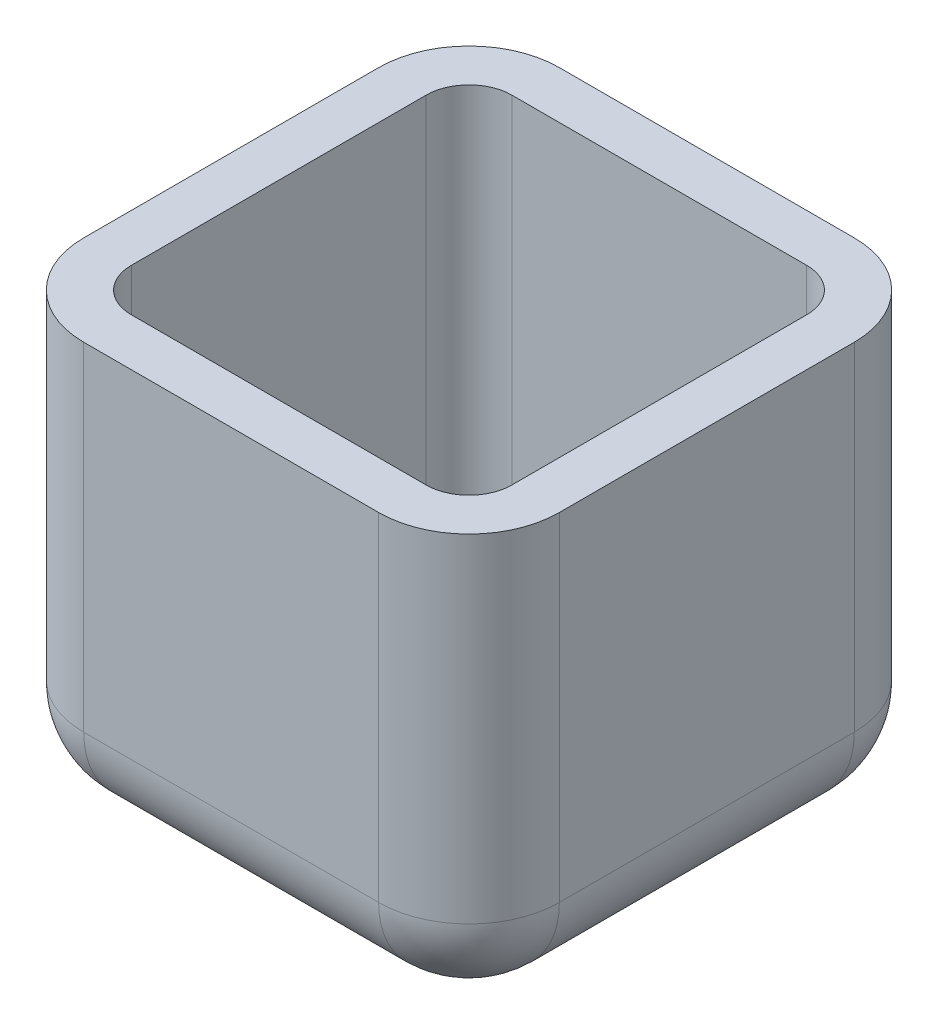
ISO-10303-21;
HEADER;
FILE_DESCRIPTION(('STEP AP214'),'2;1');
FILE_NAME('part.step','',(''),(''),'','','');
FILE_SCHEMA(('AUTOMOTIVE_DESIGN { 1 0 10303 214 1 1 1 1 }'));
ENDSEC;
DATA;
#1=APPLICATION_CONTEXT('core data for automotive mechanical design processes');
#2=APPLICATION_PROTOCOL_DEFINITION('international standard','automotive_design',2000,#1);
#3=PRODUCT_CONTEXT('',#1,'mechanical');
#4=PRODUCT('Part','Part','',(#3));
#5=PRODUCT_RELATED_PRODUCT_CATEGORY('part','',(#4));
#6=PRODUCT_DEFINITION_FORMATION('','',#4);
#7=PRODUCT_DEFINITION_CONTEXT('part definition',#1,'design');
#8=PRODUCT_DEFINITION('design','',#6,#7);
#9=PRODUCT_DEFINITION_SHAPE('','',#8);
#10=(LENGTH_UNIT() NAMED_UNIT(*) SI_UNIT(.MILLI.,.METRE.));
#11=(NAMED_UNIT(*) PLANE_ANGLE_UNIT() SI_UNIT($,.RADIAN.));
#12=(NAMED_UNIT(*) SI_UNIT($,.STERADIAN.) SOLID_ANGLE_UNIT());
#13=UNCERTAINTY_MEASURE_WITH_UNIT(LENGTH_MEASURE(1.E-05),#10,'distance_accuracy_value','');
#14=(GEOMETRIC_REPRESENTATION_CONTEXT(3) GLOBAL_UNCERTAINTY_ASSIGNED_CONTEXT((#13)) GLOBAL_UNIT_ASSIGNED_CONTEXT((#10,
#11,#12)) REPRESENTATION_CONTEXT('',''));
#15=CARTESIAN_POINT('',(0.,0.,0.));
#16=DIRECTION('',(0.,0.,1.));
#17=DIRECTION('',(1.,0.,0.));
#18=AXIS2_PLACEMENT_3D('',#15,#16,#17);
#19=CARTESIAN_POINT('',(25.,45.,-25.));
#20=DIRECTION('',(-1.,0.,0.));
#21=DIRECTION('',(0.,0.,1.));
#22=AXIS2_PLACEMENT_3D('',#19,#20,#21);
#23=PLANE('',#22);
#24=DIRECTION('',(0.,0.,-1.));
#25=VECTOR('',#24,1.);
#26=CARTESIAN_POINT('',(25.,45.,-25.));
#27=LINE('',#26,#25);
#28=CARTESIAN_POINT('',(25.,45.,15.5));
#29=VERTEX_POINT('',#28);
#30=CARTESIAN_POINT('',(25.,45.,-15.5));
#31=VERTEX_POINT('',#30);
#32=EDGE_CURVE('E315',#29,#31,#27,.T.);
#33=ORIENTED_EDGE('',*,*,#32,.F.);
#34=DIRECTION('',(0.,-1.,0.));
#35=VECTOR('',#34,1.);
#36=CARTESIAN_POINT('',(25.,45.,15.5));
#37=LINE('',#36,#35);
#38=CARTESIAN_POINT('',(25.,9.5,15.5));
#39=VERTEX_POINT('',#38);
#40=EDGE_CURVE('E58',#29,#39,#37,.T.);
#41=ORIENTED_EDGE('',*,*,#40,.T.);
#42=DIRECTION('',(0.,0.,-1.));
#43=VECTOR('',#42,1.);
#44=CARTESIAN_POINT('',(25.,9.5,-25.));
#45=LINE('',#44,#43);
#46=CARTESIAN_POINT('',(25.,9.5,-15.5));
#47=VERTEX_POINT('',#46);
#48=EDGE_CURVE('E63',#39,#47,#45,.T.);
#49=ORIENTED_EDGE('',*,*,#48,.T.);
#50=DIRECTION('',(0.,-1.,0.));
#51=VECTOR('',#50,1.);
#52=CARTESIAN_POINT('',(25.,45.,-15.5));
#53=LINE('',#52,#51);
#54=EDGE_CURVE('E254',#47,#31,#53,.F.);
#55=ORIENTED_EDGE('',*,*,#54,.T.);
#56=EDGE_LOOP('',(#33,#41,#49,#55));
#57=FACE_BOUND('',#56,.T.);
#58=ADVANCED_FACE('F41',(#57),#23,.F.);
#59=CARTESIAN_POINT('',(-25.,45.,-25.));
#60=DIRECTION('',(0.,0.,1.));
#61=DIRECTION('',(1.,0.,0.));
#62=AXIS2_PLACEMENT_3D('',#59,#60,#61);
#63=PLANE('',#62);
#64=DIRECTION('',(-1.,0.,0.));
#65=VECTOR('',#64,1.);
#66=CARTESIAN_POINT('',(-25.,9.5,-25.));
#67=LINE('',#66,#65);
#68=CARTESIAN_POINT('',(15.5,9.5,-25.));
#69=VERTEX_POINT('',#68);
#70=CARTESIAN_POINT('',(-15.5,9.5,-25.));
#71=VERTEX_POINT('',#70);
#72=EDGE_CURVE('E228',#69,#71,#67,.T.);
#73=ORIENTED_EDGE('',*,*,#72,.T.);
#74=DIRECTION('',(0.,-1.,0.));
#75=VECTOR('',#74,1.);
#76=CARTESIAN_POINT('',(-15.5,45.,-25.));
#77=LINE('',#76,#75);
#78=CARTESIAN_POINT('',(-15.5,45.,-25.));
#79=VERTEX_POINT('',#78);
#80=EDGE_CURVE('E231',#71,#79,#77,.F.);
#81=ORIENTED_EDGE('',*,*,#80,.T.);
#82=DIRECTION('',(-1.,0.,0.));
#83=VECTOR('',#82,1.);
#84=CARTESIAN_POINT('',(-25.,45.,-25.));
#85=LINE('',#84,#83);
#86=CARTESIAN_POINT('',(15.5,45.,-25.));
#87=VERTEX_POINT('',#86);
#88=EDGE_CURVE('E318',#87,#79,#85,.T.);
#89=ORIENTED_EDGE('',*,*,#88,.F.);
#90=DIRECTION('',(0.,-1.,0.));
#91=VECTOR('',#90,1.);
#92=CARTESIAN_POINT('',(15.5,45.,-25.));
#93=LINE('',#92,#91);
#94=EDGE_CURVE('E226',#87,#69,#93,.T.);
#95=ORIENTED_EDGE('',*,*,#94,.T.);
#96=EDGE_LOOP('',(#73,#81,#89,#95));
#97=FACE_BOUND('',#96,.T.);
#98=ADVANCED_FACE('F364',(#97),#63,.F.);
#99=CARTESIAN_POINT('',(-25.,45.,-25.));
#100=DIRECTION('',(1.,0.,0.));
#101=DIRECTION('',(0.,0.,-1.));
#102=AXIS2_PLACEMENT_3D('',#99,#100,#101);
#103=PLANE('',#102);
#104=DIRECTION('',(0.,0.,1.));
#105=VECTOR('',#104,1.);
#106=CARTESIAN_POINT('',(-25.,9.5,-25.));
#107=LINE('',#106,#105);
#108=CARTESIAN_POINT('',(-25.,9.5,-15.5));
#109=VERTEX_POINT('',#108);
#110=CARTESIAN_POINT('',(-25.,9.5,15.5));
#111=VERTEX_POINT('',#110);
#112=EDGE_CURVE('E244',#109,#111,#107,.T.);
#113=ORIENTED_EDGE('',*,*,#112,.T.);
#114=DIRECTION('',(0.,-1.,0.));
#115=VECTOR('',#114,1.);
#116=CARTESIAN_POINT('',(-25.,45.,15.5));
#117=LINE('',#116,#115);
#118=CARTESIAN_POINT('',(-25.,45.,15.5));
#119=VERTEX_POINT('',#118);
#120=EDGE_CURVE('E246',#111,#119,#117,.F.);
#121=ORIENTED_EDGE('',*,*,#120,.T.);
#122=DIRECTION('',(0.,0.,1.));
#123=VECTOR('',#122,1.);
#124=CARTESIAN_POINT('',(-25.,45.,-25.));
#125=LINE('',#124,#123);
#126=CARTESIAN_POINT('',(-25.,45.,-15.5));
#127=VERTEX_POINT('',#126);
#128=EDGE_CURVE('E196',#127,#119,#125,.T.);
#129=ORIENTED_EDGE('',*,*,#128,.F.);
#130=DIRECTION('',(0.,-1.,0.));
#131=VECTOR('',#130,1.);
#132=CARTESIAN_POINT('',(-25.,45.,-15.5));
#133=LINE('',#132,#131);
#134=EDGE_CURVE('E242',#127,#109,#133,.T.);
#135=ORIENTED_EDGE('',*,*,#134,.T.);
#136=EDGE_LOOP('',(#113,#121,#129,#135));
#137=FACE_BOUND('',#136,.T.);
#138=ADVANCED_FACE('F370',(#137),#103,.F.);
#139=CARTESIAN_POINT('',(-25.,45.,25.));
#140=DIRECTION('',(0.,0.,-1.));
#141=DIRECTION('',(-1.,0.,0.));
#142=AXIS2_PLACEMENT_3D('',#139,#140,#141);
#143=PLANE('',#142);
#144=DIRECTION('',(1.,0.,0.));
#145=VECTOR('',#144,1.);
#146=CARTESIAN_POINT('',(-25.,9.5,25.));
#147=LINE('',#146,#145);
#148=CARTESIAN_POINT('',(-15.5,9.5,25.));
#149=VERTEX_POINT('',#148);
#150=CARTESIAN_POINT('',(15.5,9.5,25.));
#151=VERTEX_POINT('',#150);
#152=EDGE_CURVE('E250',#149,#151,#147,.T.);
#153=ORIENTED_EDGE('',*,*,#152,.T.);
#154=DIRECTION('',(0.,-1.,0.));
#155=VECTOR('',#154,1.);
#156=CARTESIAN_POINT('',(15.5,45.,25.));
#157=LINE('',#156,#155);
#158=CARTESIAN_POINT('',(15.5,45.,25.));
#159=VERTEX_POINT('',#158);
#160=EDGE_CURVE('E252',#151,#159,#157,.F.);
#161=ORIENTED_EDGE('',*,*,#160,.T.);
#162=DIRECTION('',(1.,0.,0.));
#163=VECTOR('',#162,1.);
#164=CARTESIAN_POINT('',(-25.,45.,25.));
#165=LINE('',#164,#163);
#166=CARTESIAN_POINT('',(-15.5,45.,25.));
#167=VERTEX_POINT('',#166);
#168=EDGE_CURVE('E192',#167,#159,#165,.T.);
#169=ORIENTED_EDGE('',*,*,#168,.F.);
#170=DIRECTION('',(0.,-1.,0.));
#171=VECTOR('',#170,1.);
#172=CARTESIAN_POINT('',(-15.5,45.,25.));
#173=LINE('',#172,#171);
#174=EDGE_CURVE('E248',#167,#149,#173,.T.);
#175=ORIENTED_EDGE('',*,*,#174,.T.);
#176=EDGE_LOOP('',(#153,#161,#169,#175));
#177=FACE_BOUND('',#176,.T.);
#178=ADVANCED_FACE('F336',(#177),#143,.F.);
#179=CARTESIAN_POINT('',(0.,45.,0.));
#180=DIRECTION('',(0.,1.,0.));
#181=DIRECTION('',(0.,0.,1.));
#182=AXIS2_PLACEMENT_3D('',#179,#180,#181);
#183=PLANE('',#182);
#184=DIRECTION('',(0.,0.,-1.));
#185=VECTOR('',#184,1.);
#186=CARTESIAN_POINT('',(20.,45.,-25.));
#187=LINE('',#186,#185);
#188=CARTESIAN_POINT('',(20.,45.,15.5));
#189=VERTEX_POINT('',#188);
#190=CARTESIAN_POINT('',(20.,45.,-15.5));
#191=VERTEX_POINT('',#190);
#192=EDGE_CURVE('E304',#189,#191,#187,.T.);
#193=ORIENTED_EDGE('',*,*,#192,.F.);
#194=CARTESIAN_POINT('',(15.5,45.,15.5));
#195=DIRECTION('',(0.,1.,0.));
#196=DIRECTION('',(0.,0.,1.));
#197=AXIS2_PLACEMENT_3D('',#194,#195,#196);
#198=CIRCLE('',#197,4.5);
#199=CARTESIAN_POINT('',(15.5,45.,20.));
#200=VERTEX_POINT('',#199);
#201=EDGE_CURVE('E221',#189,#200,#198,.F.);
#202=ORIENTED_EDGE('',*,*,#201,.T.);
#203=DIRECTION('',(1.,0.,0.));
#204=VECTOR('',#203,1.);
#205=CARTESIAN_POINT('',(-25.,45.,20.));
#206=LINE('',#205,#204);
#207=CARTESIAN_POINT('',(-15.5,45.,20.));
#208=VERTEX_POINT('',#207);
#209=EDGE_CURVE('E312',#208,#200,#206,.T.);
#210=ORIENTED_EDGE('',*,*,#209,.F.);
#211=CARTESIAN_POINT('',(-15.5,45.,15.5));
#212=DIRECTION('',(0.,1.,0.));
#213=DIRECTION('',(0.,0.,1.));
#214=AXIS2_PLACEMENT_3D('',#211,#212,#213);
#215=CIRCLE('',#214,4.5);
#216=CARTESIAN_POINT('',(-20.,45.,15.5));
#217=VERTEX_POINT('',#216);
#218=EDGE_CURVE('E219',#208,#217,#215,.F.);
#219=ORIENTED_EDGE('',*,*,#218,.T.);
#220=DIRECTION('',(0.,0.,1.));
#221=VECTOR('',#220,1.);
#222=CARTESIAN_POINT('',(-20.,45.,-25.));
#223=LINE('',#222,#221);
#224=CARTESIAN_POINT('',(-20.,45.,-15.5));
#225=VERTEX_POINT('',#224);
#226=EDGE_CURVE('E310',#225,#217,#223,.T.);
#227=ORIENTED_EDGE('',*,*,#226,.F.);
#228=CARTESIAN_POINT('',(-15.5,45.,-15.5));
#229=DIRECTION('',(0.,1.,0.));
#230=DIRECTION('',(0.,0.,1.));
#231=AXIS2_PLACEMENT_3D('',#228,#229,#230);
#232=CIRCLE('',#231,4.5);
#233=CARTESIAN_POINT('',(-15.5,45.,-20.));
#234=VERTEX_POINT('',#233);
#235=EDGE_CURVE('E191',#225,#234,#232,.F.);
#236=ORIENTED_EDGE('',*,*,#235,.T.);
#237=DIRECTION('',(-1.,0.,0.));
#238=VECTOR('',#237,1.);
#239=CARTESIAN_POINT('',(-25.,45.,-20.));
#240=LINE('',#239,#238);
#241=CARTESIAN_POINT('',(15.5,45.,-20.));
#242=VERTEX_POINT('',#241);
#243=EDGE_CURVE('E307',#242,#234,#240,.T.);
#244=ORIENTED_EDGE('',*,*,#243,.F.);
#245=CARTESIAN_POINT('',(15.5,45.,-15.5));
#246=DIRECTION('',(0.,1.,0.));
#247=DIRECTION('',(0.,0.,1.));
#248=AXIS2_PLACEMENT_3D('',#245,#246,#247);
#249=CIRCLE('',#248,4.5);
#250=EDGE_CURVE('E223',#242,#191,#249,.F.);
#251=ORIENTED_EDGE('',*,*,#250,.T.);
#252=EDGE_LOOP('',(#193,#202,#210,#219,#227,#236,#244,#251));
#253=FACE_BOUND('',#252,.T.);
#254=ORIENTED_EDGE('',*,*,#168,.T.);
#255=CARTESIAN_POINT('',(15.5,45.,15.5));
#256=DIRECTION('',(0.,1.,0.));
#257=DIRECTION('',(0.,0.,1.));
#258=AXIS2_PLACEMENT_3D('',#255,#256,#257);
#259=CIRCLE('',#258,9.5);
#260=EDGE_CURVE('E11',#159,#29,#259,.T.);
#261=ORIENTED_EDGE('',*,*,#260,.T.);
#262=ORIENTED_EDGE('',*,*,#32,.T.);
#263=CARTESIAN_POINT('',(15.5,45.,-15.5));
#264=DIRECTION('',(0.,1.,0.));
#265=DIRECTION('',(0.,0.,1.));
#266=AXIS2_PLACEMENT_3D('',#263,#264,#265);
#267=CIRCLE('',#266,9.5);
#268=EDGE_CURVE('E258',#31,#87,#267,.T.);
#269=ORIENTED_EDGE('',*,*,#268,.T.);
#270=ORIENTED_EDGE('',*,*,#88,.T.);
#271=CARTESIAN_POINT('',(-15.5,45.,-15.5));
#272=DIRECTION('',(0.,1.,0.));
#273=DIRECTION('',(0.,0.,1.));
#274=AXIS2_PLACEMENT_3D('',#271,#272,#273);
#275=CIRCLE('',#274,9.5);
#276=EDGE_CURVE('E260',#79,#127,#275,.T.);
#277=ORIENTED_EDGE('',*,*,#276,.T.);
#278=ORIENTED_EDGE('',*,*,#128,.T.);
#279=CARTESIAN_POINT('',(-15.5,45.,15.5));
#280=DIRECTION('',(0.,1.,0.));
#281=DIRECTION('',(0.,0.,1.));
#282=AXIS2_PLACEMENT_3D('',#279,#280,#281);
#283=CIRCLE('',#282,9.5);
#284=EDGE_CURVE('E50',#119,#167,#283,.T.);
#285=ORIENTED_EDGE('',*,*,#284,.T.);
#286=EDGE_LOOP('',(#254,#261,#262,#269,#270,#277,#278,#285));
#287=FACE_BOUND('',#286,.T.);
#288=ADVANCED_FACE('F324',(#253,#287),#183,.T.);
#289=CARTESIAN_POINT('',(0.,0.,0.));
#290=DIRECTION('',(0.,1.,0.));
#291=DIRECTION('',(0.,0.,1.));
#292=AXIS2_PLACEMENT_3D('',#289,#290,#291);
#293=PLANE('',#292);
#294=DIRECTION('',(0.,0.,1.));
#295=VECTOR('',#294,1.);
#296=CARTESIAN_POINT('',(-15.5,0.,0.));
#297=LINE('',#296,#295);
#298=CARTESIAN_POINT('',(-15.5,0.,15.5));
#299=VERTEX_POINT('',#298);
#300=CARTESIAN_POINT('',(-15.5,0.,-15.5));
#301=VERTEX_POINT('',#300);
#302=EDGE_CURVE('E237',#299,#301,#297,.F.);
#303=ORIENTED_EDGE('',*,*,#302,.T.);
#304=DIRECTION('',(-1.,0.,0.));
#305=VECTOR('',#304,1.);
#306=CARTESIAN_POINT('',(0.,0.,-15.5));
#307=LINE('',#306,#305);
#308=CARTESIAN_POINT('',(15.5,0.,-15.5));
#309=VERTEX_POINT('',#308);
#310=EDGE_CURVE('E239',#301,#309,#307,.F.);
#311=ORIENTED_EDGE('',*,*,#310,.T.);
#312=DIRECTION('',(0.,0.,-1.));
#313=VECTOR('',#312,1.);
#314=CARTESIAN_POINT('',(15.5,0.,0.));
#315=LINE('',#314,#313);
#316=CARTESIAN_POINT('',(15.5,0.,15.5));
#317=VERTEX_POINT('',#316);
#318=EDGE_CURVE('E233',#309,#317,#315,.F.);
#319=ORIENTED_EDGE('',*,*,#318,.T.);
#320=DIRECTION('',(1.,0.,0.));
#321=VECTOR('',#320,1.);
#322=CARTESIAN_POINT('',(0.,0.,15.5));
#323=LINE('',#322,#321);
#324=EDGE_CURVE('E235',#317,#299,#323,.F.);
#325=ORIENTED_EDGE('',*,*,#324,.T.);
#326=EDGE_LOOP('',(#303,#311,#319,#325));
#327=FACE_BOUND('',#326,.T.);
#328=ADVANCED_FACE('F344',(#327),#293,.F.);
#329=CARTESIAN_POINT('',(20.,45.,-25.));
#330=DIRECTION('',(-1.,0.,0.));
#331=DIRECTION('',(0.,0.,1.));
#332=AXIS2_PLACEMENT_3D('',#329,#330,#331);
#333=PLANE('',#332);
#334=DIRECTION('',(0.,0.,-1.));
#335=VECTOR('',#334,1.);
#336=CARTESIAN_POINT('',(20.,5.,-25.));
#337=LINE('',#336,#335);
#338=CARTESIAN_POINT('',(20.,5.,15.5));
#339=VERTEX_POINT('',#338);
#340=CARTESIAN_POINT('',(20.,5.,-15.5));
#341=VERTEX_POINT('',#340);
#342=EDGE_CURVE('E295',#339,#341,#337,.T.);
#343=ORIENTED_EDGE('',*,*,#342,.F.);
#344=DIRECTION('',(0.,-1.,0.));
#345=VECTOR('',#344,1.);
#346=CARTESIAN_POINT('',(20.,45.,15.5));
#347=LINE('',#346,#345);
#348=EDGE_CURVE('E213',#339,#189,#347,.F.);
#349=ORIENTED_EDGE('',*,*,#348,.T.);
#350=ORIENTED_EDGE('',*,*,#192,.T.);
#351=DIRECTION('',(0.,-1.,0.));
#352=VECTOR('',#351,1.);
#353=CARTESIAN_POINT('',(20.,5.,-15.5));
#354=LINE('',#353,#352);
#355=EDGE_CURVE('E210',#191,#341,#354,.T.);
#356=ORIENTED_EDGE('',*,*,#355,.T.);
#357=EDGE_LOOP('',(#343,#349,#350,#356));
#358=FACE_BOUND('',#357,.T.);
#359=ADVANCED_FACE('F532',(#358),#333,.T.);
#360=CARTESIAN_POINT('',(-25.,45.,-20.));
#361=DIRECTION('',(0.,0.,1.));
#362=DIRECTION('',(1.,0.,0.));
#363=AXIS2_PLACEMENT_3D('',#360,#361,#362);
#364=PLANE('',#363);
#365=DIRECTION('',(-1.,0.,0.));
#366=VECTOR('',#365,1.);
#367=CARTESIAN_POINT('',(-25.,5.,-20.));
#368=LINE('',#367,#366);
#369=CARTESIAN_POINT('',(15.5,5.,-20.));
#370=VERTEX_POINT('',#369);
#371=CARTESIAN_POINT('',(-15.5,5.,-20.));
#372=VERTEX_POINT('',#371);
#373=EDGE_CURVE('E172',#370,#372,#368,.T.);
#374=ORIENTED_EDGE('',*,*,#373,.F.);
#375=DIRECTION('',(0.,-1.,0.));
#376=VECTOR('',#375,1.);
#377=CARTESIAN_POINT('',(15.5,45.,-20.));
#378=LINE('',#377,#376);
#379=EDGE_CURVE('E217',#370,#242,#378,.F.);
#380=ORIENTED_EDGE('',*,*,#379,.T.);
#381=ORIENTED_EDGE('',*,*,#243,.T.);
#382=DIRECTION('',(0.,-1.,0.));
#383=VECTOR('',#382,1.);
#384=CARTESIAN_POINT('',(-15.5,5.,-20.));
#385=LINE('',#384,#383);
#386=EDGE_CURVE('E215',#234,#372,#385,.T.);
#387=ORIENTED_EDGE('',*,*,#386,.T.);
#388=EDGE_LOOP('',(#374,#380,#381,#387));
#389=FACE_BOUND('',#388,.T.);
#390=ADVANCED_FACE('F524',(#389),#364,.T.);
#391=CARTESIAN_POINT('',(-20.,45.,-25.));
#392=DIRECTION('',(1.,0.,0.));
#393=DIRECTION('',(0.,0.,-1.));
#394=AXIS2_PLACEMENT_3D('',#391,#392,#393);
#395=PLANE('',#394);
#396=ORIENTED_EDGE('',*,*,#226,.T.);
#397=DIRECTION('',(0.,-1.,0.));
#398=VECTOR('',#397,1.);
#399=CARTESIAN_POINT('',(-20.,5.,15.5));
#400=LINE('',#399,#398);
#401=CARTESIAN_POINT('',(-20.,5.,15.5));
#402=VERTEX_POINT('',#401);
#403=EDGE_CURVE('E178',#217,#402,#400,.T.);
#404=ORIENTED_EDGE('',*,*,#403,.T.);
#405=DIRECTION('',(0.,0.,1.));
#406=VECTOR('',#405,1.);
#407=CARTESIAN_POINT('',(-20.,5.,-25.));
#408=LINE('',#407,#406);
#409=CARTESIAN_POINT('',(-20.,5.,-15.5));
#410=VERTEX_POINT('',#409);
#411=EDGE_CURVE('E170',#410,#402,#408,.T.);
#412=ORIENTED_EDGE('',*,*,#411,.F.);
#413=DIRECTION('',(0.,-1.,0.));
#414=VECTOR('',#413,1.);
#415=CARTESIAN_POINT('',(-20.,45.,-15.5));
#416=LINE('',#415,#414);
#417=EDGE_CURVE('E184',#410,#225,#416,.F.);
#418=ORIENTED_EDGE('',*,*,#417,.T.);
#419=EDGE_LOOP('',(#396,#404,#412,#418));
#420=FACE_BOUND('',#419,.T.);
#421=ADVANCED_FACE('F183',(#420),#395,.T.);
#422=CARTESIAN_POINT('',(-25.,45.,20.));
#423=DIRECTION('',(0.,0.,-1.));
#424=DIRECTION('',(-1.,0.,0.));
#425=AXIS2_PLACEMENT_3D('',#422,#423,#424);
#426=PLANE('',#425);
#427=DIRECTION('',(1.,0.,0.));
#428=VECTOR('',#427,1.);
#429=CARTESIAN_POINT('',(-25.,5.,20.));
#430=LINE('',#429,#428);
#431=CARTESIAN_POINT('',(-15.5,5.,20.));
#432=VERTEX_POINT('',#431);
#433=CARTESIAN_POINT('',(15.5,5.,20.));
#434=VERTEX_POINT('',#433);
#435=EDGE_CURVE('E187',#432,#434,#430,.T.);
#436=ORIENTED_EDGE('',*,*,#435,.F.);
#437=DIRECTION('',(0.,-1.,0.));
#438=VECTOR('',#437,1.);
#439=CARTESIAN_POINT('',(-15.5,45.,20.));
#440=LINE('',#439,#438);
#441=EDGE_CURVE('E208',#432,#208,#440,.F.);
#442=ORIENTED_EDGE('',*,*,#441,.T.);
#443=ORIENTED_EDGE('',*,*,#209,.T.);
#444=DIRECTION('',(0.,-1.,0.));
#445=VECTOR('',#444,1.);
#446=CARTESIAN_POINT('',(15.5,5.,20.));
#447=LINE('',#446,#445);
#448=EDGE_CURVE('E205',#200,#434,#447,.T.);
#449=ORIENTED_EDGE('',*,*,#448,.T.);
#450=EDGE_LOOP('',(#436,#442,#443,#449));
#451=FACE_BOUND('',#450,.T.);
#452=ADVANCED_FACE('F508',(#451),#426,.T.);
#453=CARTESIAN_POINT('',(0.,5.,0.));
#454=DIRECTION('',(0.,1.,0.));
#455=DIRECTION('',(0.,0.,1.));
#456=AXIS2_PLACEMENT_3D('',#453,#454,#455);
#457=PLANE('',#456);
#458=ORIENTED_EDGE('',*,*,#411,.T.);
#459=CARTESIAN_POINT('',(-15.5,5.,15.5));
#460=DIRECTION('',(0.,1.,0.));
#461=DIRECTION('',(0.,0.,1.));
#462=AXIS2_PLACEMENT_3D('',#459,#460,#461);
#463=CIRCLE('',#462,4.5);
#464=EDGE_CURVE('E203',#402,#432,#463,.T.);
#465=ORIENTED_EDGE('',*,*,#464,.T.);
#466=ORIENTED_EDGE('',*,*,#435,.T.);
#467=CARTESIAN_POINT('',(15.5,5.,15.5));
#468=DIRECTION('',(0.,1.,0.));
#469=DIRECTION('',(0.,0.,1.));
#470=AXIS2_PLACEMENT_3D('',#467,#468,#469);
#471=CIRCLE('',#470,4.5);
#472=EDGE_CURVE('E201',#434,#339,#471,.T.);
#473=ORIENTED_EDGE('',*,*,#472,.T.);
#474=ORIENTED_EDGE('',*,*,#342,.T.);
#475=CARTESIAN_POINT('',(15.5,5.,-15.5));
#476=DIRECTION('',(0.,1.,0.));
#477=DIRECTION('',(0.,0.,1.));
#478=AXIS2_PLACEMENT_3D('',#475,#476,#477);
#479=CIRCLE('',#478,4.5);
#480=EDGE_CURVE('E177',#341,#370,#479,.T.);
#481=ORIENTED_EDGE('',*,*,#480,.T.);
#482=ORIENTED_EDGE('',*,*,#373,.T.);
#483=CARTESIAN_POINT('',(-15.5,5.,-15.5));
#484=DIRECTION('',(0.,1.,0.));
#485=DIRECTION('',(0.,0.,1.));
#486=AXIS2_PLACEMENT_3D('',#483,#484,#485);
#487=CIRCLE('',#486,4.5);
#488=EDGE_CURVE('E167',#372,#410,#487,.T.);
#489=ORIENTED_EDGE('',*,*,#488,.T.);
#490=EDGE_LOOP('',(#458,#465,#466,#473,#474,#481,#482,#489));
#491=FACE_BOUND('',#490,.T.);
#492=ADVANCED_FACE('F169',(#491),#457,.T.);
#493=CARTESIAN_POINT('',(-15.5,45.,15.5));
#494=DIRECTION('',(0.,1.,0.));
#495=DIRECTION('',(0.,0.,1.));
#496=AXIS2_PLACEMENT_3D('',#493,#494,#495);
#497=CYLINDRICAL_SURFACE('',#496,4.5);
#498=ORIENTED_EDGE('',*,*,#218,.F.);
#499=ORIENTED_EDGE('',*,*,#441,.F.);
#500=ORIENTED_EDGE('',*,*,#464,.F.);
#501=ORIENTED_EDGE('',*,*,#403,.F.);
#502=EDGE_LOOP('',(#498,#499,#500,#501));
#503=FACE_BOUND('',#502,.T.);
#504=ADVANCED_FACE('F375',(#503),#497,.F.);
#505=CARTESIAN_POINT('',(15.5,45.,15.5));
#506=DIRECTION('',(0.,1.,0.));
#507=DIRECTION('',(0.,0.,1.));
#508=AXIS2_PLACEMENT_3D('',#505,#506,#507);
#509=CYLINDRICAL_SURFACE('',#508,4.5);
#510=ORIENTED_EDGE('',*,*,#201,.F.);
#511=ORIENTED_EDGE('',*,*,#348,.F.);
#512=ORIENTED_EDGE('',*,*,#472,.F.);
#513=ORIENTED_EDGE('',*,*,#448,.F.);
#514=EDGE_LOOP('',(#510,#511,#512,#513));
#515=FACE_BOUND('',#514,.T.);
#516=ADVANCED_FACE('F378',(#515),#509,.F.);
#517=CARTESIAN_POINT('',(15.5,45.,-15.5));
#518=DIRECTION('',(0.,1.,0.));
#519=DIRECTION('',(0.,0.,1.));
#520=AXIS2_PLACEMENT_3D('',#517,#518,#519);
#521=CYLINDRICAL_SURFACE('',#520,4.5);
#522=ORIENTED_EDGE('',*,*,#250,.F.);
#523=ORIENTED_EDGE('',*,*,#379,.F.);
#524=ORIENTED_EDGE('',*,*,#480,.F.);
#525=ORIENTED_EDGE('',*,*,#355,.F.);
#526=EDGE_LOOP('',(#522,#523,#524,#525));
#527=FACE_BOUND('',#526,.T.);
#528=ADVANCED_FACE('F382',(#527),#521,.F.);
#529=CARTESIAN_POINT('',(-15.5,45.,-15.5));
#530=DIRECTION('',(0.,1.,0.));
#531=DIRECTION('',(0.,0.,1.));
#532=AXIS2_PLACEMENT_3D('',#529,#530,#531);
#533=CYLINDRICAL_SURFACE('',#532,4.5);
#534=ORIENTED_EDGE('',*,*,#235,.F.);
#535=ORIENTED_EDGE('',*,*,#417,.F.);
#536=ORIENTED_EDGE('',*,*,#488,.F.);
#537=ORIENTED_EDGE('',*,*,#386,.F.);
#538=EDGE_LOOP('',(#534,#535,#536,#537));
#539=FACE_BOUND('',#538,.T.);
#540=ADVANCED_FACE('F190',(#539),#533,.F.);
#541=CARTESIAN_POINT('',(15.5,45.,15.5));
#542=DIRECTION('',(0.,-1.,0.));
#543=DIRECTION('',(0.,0.,-1.));
#544=AXIS2_PLACEMENT_3D('',#541,#542,#543);
#545=CYLINDRICAL_SURFACE('',#544,9.5);
#546=ORIENTED_EDGE('',*,*,#260,.F.);
#547=ORIENTED_EDGE('',*,*,#160,.F.);
#548=CARTESIAN_POINT('',(15.5,9.5,15.5));
#549=DIRECTION('',(0.,-1.,0.));
#550=DIRECTION('',(0.,0.,-1.));
#551=AXIS2_PLACEMENT_3D('',#548,#549,#550);
#552=CIRCLE('',#551,9.5);
#553=EDGE_CURVE('E290',#39,#151,#552,.T.);
#554=ORIENTED_EDGE('',*,*,#553,.F.);
#555=ORIENTED_EDGE('',*,*,#40,.F.);
#556=EDGE_LOOP('',(#546,#547,#554,#555));
#557=FACE_BOUND('',#556,.T.);
#558=ADVANCED_FACE('F43',(#557),#545,.T.);
#559=CARTESIAN_POINT('',(-15.5,45.,15.5));
#560=DIRECTION('',(0.,-1.,0.));
#561=DIRECTION('',(0.,0.,-1.));
#562=AXIS2_PLACEMENT_3D('',#559,#560,#561);
#563=CYLINDRICAL_SURFACE('',#562,9.5);
#564=ORIENTED_EDGE('',*,*,#284,.F.);
#565=ORIENTED_EDGE('',*,*,#120,.F.);
#566=CARTESIAN_POINT('',(-15.5,9.5,15.5));
#567=DIRECTION('',(0.,-1.,0.));
#568=DIRECTION('',(0.,0.,-1.));
#569=AXIS2_PLACEMENT_3D('',#566,#567,#568);
#570=CIRCLE('',#569,9.5);
#571=EDGE_CURVE('E288',#149,#111,#570,.T.);
#572=ORIENTED_EDGE('',*,*,#571,.F.);
#573=ORIENTED_EDGE('',*,*,#174,.F.);
#574=EDGE_LOOP('',(#564,#565,#572,#573));
#575=FACE_BOUND('',#574,.T.);
#576=ADVANCED_FACE('F332',(#575),#563,.T.);
#577=CARTESIAN_POINT('',(-25.,9.5,15.5));
#578=DIRECTION('',(1.,0.,0.));
#579=DIRECTION('',(0.,0.,-1.));
#580=AXIS2_PLACEMENT_3D('',#577,#578,#579);
#581=CYLINDRICAL_SURFACE('',#580,9.5);
#582=CARTESIAN_POINT('',(15.5,9.5,15.5));
#583=DIRECTION('',(1.,0.,0.));
#584=DIRECTION('',(0.,0.,-1.));
#585=AXIS2_PLACEMENT_3D('',#582,#583,#584);
#586=CIRCLE('',#585,9.5);
#587=EDGE_CURVE('E45',#151,#317,#586,.T.);
#588=ORIENTED_EDGE('',*,*,#587,.F.);
#589=ORIENTED_EDGE('',*,*,#152,.F.);
#590=CARTESIAN_POINT('',(-15.5,9.5,15.5));
#591=DIRECTION('',(-1.,0.,0.));
#592=DIRECTION('',(0.,0.,1.));
#593=AXIS2_PLACEMENT_3D('',#590,#591,#592);
#594=CIRCLE('',#593,9.5);
#595=EDGE_CURVE('E285',#299,#149,#594,.T.);
#596=ORIENTED_EDGE('',*,*,#595,.F.);
#597=ORIENTED_EDGE('',*,*,#324,.F.);
#598=EDGE_LOOP('',(#588,#589,#596,#597));
#599=FACE_BOUND('',#598,.T.);
#600=ADVANCED_FACE('F340',(#599),#581,.T.);
#601=CARTESIAN_POINT('',(15.5,9.5,15.5));
#602=DIRECTION('',(0.,0.,1.));
#603=DIRECTION('',(0.,-1.,0.));
#604=AXIS2_PLACEMENT_3D('',#601,#602,#603);
#605=SPHERICAL_SURFACE('',#604,9.5);
#606=ORIENTED_EDGE('',*,*,#553,.T.);
#607=ORIENTED_EDGE('',*,*,#587,.T.);
#608=CARTESIAN_POINT('',(15.5,9.5,15.5));
#609=DIRECTION('',(0.,0.,1.));
#610=DIRECTION('',(1.,0.,0.));
#611=AXIS2_PLACEMENT_3D('',#608,#609,#610);
#612=CIRCLE('',#611,9.5);
#613=EDGE_CURVE('E282',#39,#317,#612,.F.);
#614=ORIENTED_EDGE('',*,*,#613,.F.);
#615=EDGE_LOOP('',(#606,#607,#614));
#616=FACE_BOUND('',#615,.T.);
#617=ADVANCED_FACE('F352',(#616),#605,.T.);
#618=CARTESIAN_POINT('',(-15.5,9.5,15.5));
#619=DIRECTION('',(0.,0.,1.));
#620=DIRECTION('',(1.,0.,0.));
#621=AXIS2_PLACEMENT_3D('',#618,#619,#620);
#622=SPHERICAL_SURFACE('',#621,9.5);
#623=ORIENTED_EDGE('',*,*,#595,.T.);
#624=ORIENTED_EDGE('',*,*,#571,.T.);
#625=CARTESIAN_POINT('',(-15.5,9.5,15.5));
#626=DIRECTION('',(0.,0.,1.));
#627=DIRECTION('',(1.,0.,0.));
#628=AXIS2_PLACEMENT_3D('',#625,#626,#627);
#629=CIRCLE('',#628,9.5);
#630=EDGE_CURVE('E279',#299,#111,#629,.F.);
#631=ORIENTED_EDGE('',*,*,#630,.F.);
#632=EDGE_LOOP('',(#623,#624,#631));
#633=FACE_BOUND('',#632,.T.);
#634=ADVANCED_FACE('F354',(#633),#622,.T.);
#635=CARTESIAN_POINT('',(15.5,9.5,-25.));
#636=DIRECTION('',(0.,0.,-1.));
#637=DIRECTION('',(-1.,0.,0.));
#638=AXIS2_PLACEMENT_3D('',#635,#636,#637);
#639=CYLINDRICAL_SURFACE('',#638,9.5);
#640=ORIENTED_EDGE('',*,*,#613,.T.);
#641=ORIENTED_EDGE('',*,*,#318,.F.);
#642=CARTESIAN_POINT('',(15.5,9.5,-15.5));
#643=DIRECTION('',(0.,0.,-1.));
#644=DIRECTION('',(-1.,0.,0.));
#645=AXIS2_PLACEMENT_3D('',#642,#643,#644);
#646=CIRCLE('',#645,9.5);
#647=EDGE_CURVE('E276',#47,#309,#646,.T.);
#648=ORIENTED_EDGE('',*,*,#647,.F.);
#649=ORIENTED_EDGE('',*,*,#48,.F.);
#650=EDGE_LOOP('',(#640,#641,#648,#649));
#651=FACE_BOUND('',#650,.T.);
#652=ADVANCED_FACE('F351',(#651),#639,.T.);
#653=CARTESIAN_POINT('',(15.5,45.,-15.5));
#654=DIRECTION('',(0.,-1.,0.));
#655=DIRECTION('',(0.,0.,-1.));
#656=AXIS2_PLACEMENT_3D('',#653,#654,#655);
#657=CYLINDRICAL_SURFACE('',#656,9.5);
#658=ORIENTED_EDGE('',*,*,#268,.F.);
#659=ORIENTED_EDGE('',*,*,#54,.F.);
#660=CARTESIAN_POINT('',(15.5,9.5,-15.5));
#661=DIRECTION('',(0.,-1.,0.));
#662=DIRECTION('',(0.,0.,-1.));
#663=AXIS2_PLACEMENT_3D('',#660,#661,#662);
#664=CIRCLE('',#663,9.5);
#665=EDGE_CURVE('E273',#69,#47,#664,.T.);
#666=ORIENTED_EDGE('',*,*,#665,.F.);
#667=ORIENTED_EDGE('',*,*,#94,.F.);
#668=EDGE_LOOP('',(#658,#659,#666,#667));
#669=FACE_BOUND('',#668,.T.);
#670=ADVANCED_FACE('F407',(#669),#657,.T.);
#671=CARTESIAN_POINT('',(-15.5,45.,-15.5));
#672=DIRECTION('',(0.,-1.,0.));
#673=DIRECTION('',(0.,0.,-1.));
#674=AXIS2_PLACEMENT_3D('',#671,#672,#673);
#675=CYLINDRICAL_SURFACE('',#674,9.5);
#676=ORIENTED_EDGE('',*,*,#276,.F.);
#677=ORIENTED_EDGE('',*,*,#80,.F.);
#678=CARTESIAN_POINT('',(-15.5,9.5,-15.5));
#679=DIRECTION('',(0.,-1.,0.));
#680=DIRECTION('',(0.,0.,-1.));
#681=AXIS2_PLACEMENT_3D('',#678,#679,#680);
#682=CIRCLE('',#681,9.5);
#683=EDGE_CURVE('E270',#109,#71,#682,.T.);
#684=ORIENTED_EDGE('',*,*,#683,.F.);
#685=ORIENTED_EDGE('',*,*,#134,.F.);
#686=EDGE_LOOP('',(#676,#677,#684,#685));
#687=FACE_BOUND('',#686,.T.);
#688=ADVANCED_FACE('F403',(#687),#675,.T.);
#689=CARTESIAN_POINT('',(-15.5,9.5,-25.));
#690=DIRECTION('',(0.,0.,1.));
#691=DIRECTION('',(1.,0.,0.));
#692=AXIS2_PLACEMENT_3D('',#689,#690,#691);
#693=CYLINDRICAL_SURFACE('',#692,9.5);
#694=ORIENTED_EDGE('',*,*,#630,.T.);
#695=ORIENTED_EDGE('',*,*,#112,.F.);
#696=CARTESIAN_POINT('',(-15.5,9.5,-15.5));
#697=DIRECTION('',(0.,0.,-1.));
#698=DIRECTION('',(-1.,0.,0.));
#699=AXIS2_PLACEMENT_3D('',#696,#697,#698);
#700=CIRCLE('',#699,9.5);
#701=EDGE_CURVE('E267',#301,#109,#700,.T.);
#702=ORIENTED_EDGE('',*,*,#701,.F.);
#703=ORIENTED_EDGE('',*,*,#302,.F.);
#704=EDGE_LOOP('',(#694,#695,#702,#703));
#705=FACE_BOUND('',#704,.T.);
#706=ADVANCED_FACE('F399',(#705),#693,.T.);
#707=CARTESIAN_POINT('',(15.5,9.5,-15.5));
#708=DIRECTION('',(1.,0.,0.));
#709=DIRECTION('',(0.,0.,-1.));
#710=AXIS2_PLACEMENT_3D('',#707,#708,#709);
#711=SPHERICAL_SURFACE('',#710,9.5);
#712=ORIENTED_EDGE('',*,*,#665,.T.);
#713=ORIENTED_EDGE('',*,*,#647,.T.);
#714=CARTESIAN_POINT('',(15.5,9.5,-15.5));
#715=DIRECTION('',(1.,0.,0.));
#716=DIRECTION('',(0.,0.,-1.));
#717=AXIS2_PLACEMENT_3D('',#714,#715,#716);
#718=CIRCLE('',#717,9.5);
#719=EDGE_CURVE('E265',#69,#309,#718,.F.);
#720=ORIENTED_EDGE('',*,*,#719,.F.);
#721=EDGE_LOOP('',(#712,#713,#720));
#722=FACE_BOUND('',#721,.T.);
#723=ADVANCED_FACE('F395',(#722),#711,.T.);
#724=CARTESIAN_POINT('',(-15.5,9.5,-15.5));
#725=DIRECTION('',(-1.,0.,0.));
#726=DIRECTION('',(0.,-1.,0.));
#727=AXIS2_PLACEMENT_3D('',#724,#725,#726);
#728=SPHERICAL_SURFACE('',#727,9.5);
#729=ORIENTED_EDGE('',*,*,#701,.T.);
#730=ORIENTED_EDGE('',*,*,#683,.T.);
#731=CARTESIAN_POINT('',(-15.5,9.5,-15.5));
#732=DIRECTION('',(-1.,0.,0.));
#733=DIRECTION('',(0.,0.,1.));
#734=AXIS2_PLACEMENT_3D('',#731,#732,#733);
#735=CIRCLE('',#734,9.5);
#736=EDGE_CURVE('E263',#301,#71,#735,.F.);
#737=ORIENTED_EDGE('',*,*,#736,.F.);
#738=EDGE_LOOP('',(#729,#730,#737));
#739=FACE_BOUND('',#738,.T.);
#740=ADVANCED_FACE('F391',(#739),#728,.T.);
#741=CARTESIAN_POINT('',(-25.,9.5,-15.5));
#742=DIRECTION('',(-1.,0.,0.));
#743=DIRECTION('',(0.,0.,1.));
#744=AXIS2_PLACEMENT_3D('',#741,#742,#743);
#745=CYLINDRICAL_SURFACE('',#744,9.5);
#746=ORIENTED_EDGE('',*,*,#719,.T.);
#747=ORIENTED_EDGE('',*,*,#310,.F.);
#748=ORIENTED_EDGE('',*,*,#736,.T.);
#749=ORIENTED_EDGE('',*,*,#72,.F.);
#750=EDGE_LOOP('',(#746,#747,#748,#749));
#751=FACE_BOUND('',#750,.T.);
#752=ADVANCED_FACE('F388',(#751),#745,.T.);
#753=CLOSED_SHELL('',(#58,#98,#138,#178,#288,#328,#359,#390,#421,#452,#492,#504,#516,#528,#540,
#558,#576,#600,#617,#634,#652,#670,#688,#706,#723,#740,#752));
#754=MANIFOLD_SOLID_BREP('B2',#753);
#755=ADVANCED_BREP_SHAPE_REPRESENTATION('',(#18,#754),#14);
#756=SHAPE_DEFINITION_REPRESENTATION(#9,#755);
ENDSEC;
END-ISO-10303-21;
